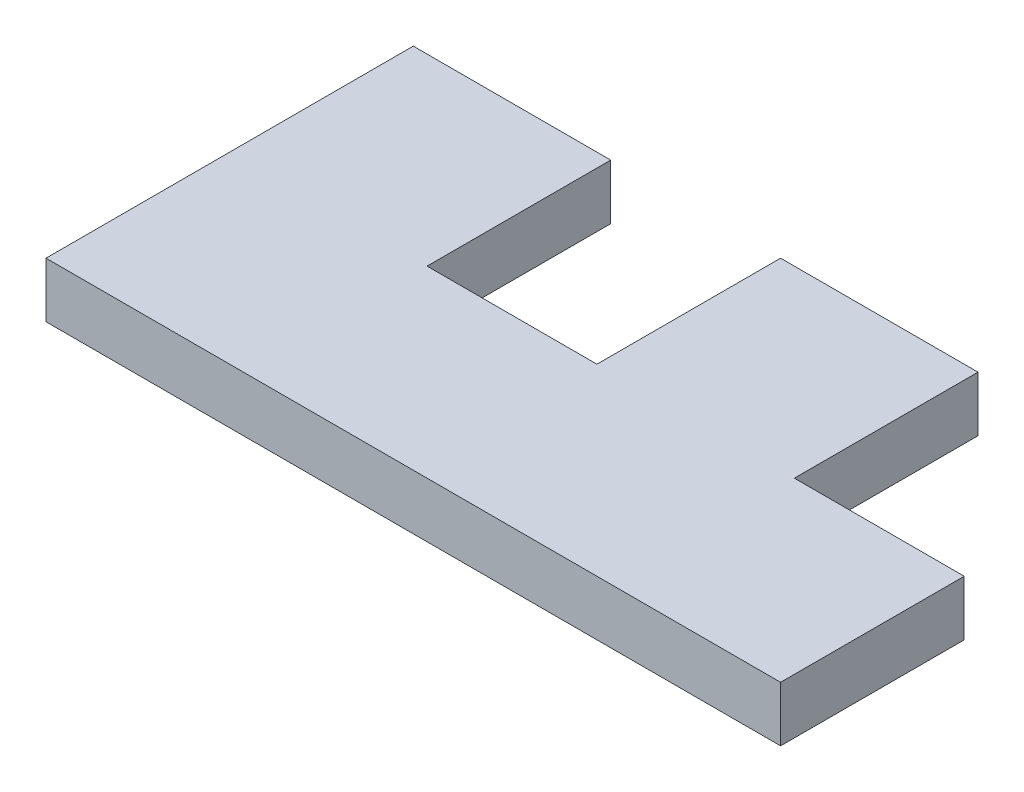
ISO-10303-21;
HEADER;
FILE_DESCRIPTION(('STEP AP214'),'2;1');
FILE_NAME('part.step','',(''),(''),'','','');
FILE_SCHEMA(('AUTOMOTIVE_DESIGN { 1 0 10303 214 1 1 1 1 }'));
ENDSEC;
DATA;
#1=APPLICATION_CONTEXT('core data for automotive mechanical design processes');
#2=APPLICATION_PROTOCOL_DEFINITION('international standard','automotive_design',2000,#1);
#3=PRODUCT_CONTEXT('',#1,'mechanical');
#4=PRODUCT('Part','Part','',(#3));
#5=PRODUCT_RELATED_PRODUCT_CATEGORY('part','',(#4));
#6=PRODUCT_DEFINITION_FORMATION('','',#4);
#7=PRODUCT_DEFINITION_CONTEXT('part definition',#1,'design');
#8=PRODUCT_DEFINITION('design','',#6,#7);
#9=PRODUCT_DEFINITION_SHAPE('','',#8);
#10=(LENGTH_UNIT() NAMED_UNIT(*) SI_UNIT(.MILLI.,.METRE.));
#11=(NAMED_UNIT(*) PLANE_ANGLE_UNIT() SI_UNIT($,.RADIAN.));
#12=(NAMED_UNIT(*) SI_UNIT($,.STERADIAN.) SOLID_ANGLE_UNIT());
#13=UNCERTAINTY_MEASURE_WITH_UNIT(LENGTH_MEASURE(1.E-05),#10,'distance_accuracy_value','');
#14=(GEOMETRIC_REPRESENTATION_CONTEXT(3) GLOBAL_UNCERTAINTY_ASSIGNED_CONTEXT((#13)) GLOBAL_UNIT_ASSIGNED_CONTEXT((#10,
#11,#12)) REPRESENTATION_CONTEXT('',''));
#15=CARTESIAN_POINT('',(0.,0.,0.));
#16=DIRECTION('',(0.,0.,1.));
#17=DIRECTION('',(1.,0.,0.));
#18=AXIS2_PLACEMENT_3D('',#15,#16,#17);
#19=CARTESIAN_POINT('',(0.,3.,-20.));
#20=DIRECTION('',(0.,0.,1.));
#21=DIRECTION('',(1.,0.,0.));
#22=AXIS2_PLACEMENT_3D('',#19,#20,#21);
#23=PLANE('',#22);
#24=DIRECTION('',(-1.,0.,0.));
#25=VECTOR('',#24,1.);
#26=CARTESIAN_POINT('',(0.,0.,-20.));
#27=LINE('',#26,#25);
#28=CARTESIAN_POINT('',(30.75,0.,-20.));
#29=VERTEX_POINT('',#28);
#30=CARTESIAN_POINT('',(20.,0.,-20.));
#31=VERTEX_POINT('',#30);
#32=EDGE_CURVE('E134',#29,#31,#27,.T.);
#33=ORIENTED_EDGE('',*,*,#32,.T.);
#34=DIRECTION('',(0.,1.,0.));
#35=VECTOR('',#34,1.);
#36=CARTESIAN_POINT('',(20.,0.,-20.));
#37=LINE('',#36,#35);
#38=CARTESIAN_POINT('',(20.,3.,-20.));
#39=VERTEX_POINT('',#38);
#40=EDGE_CURVE('E180',#31,#39,#37,.T.);
#41=ORIENTED_EDGE('',*,*,#40,.T.);
#42=DIRECTION('',(-1.,0.,0.));
#43=VECTOR('',#42,1.);
#44=CARTESIAN_POINT('',(0.,3.,-20.));
#45=LINE('',#44,#43);
#46=CARTESIAN_POINT('',(30.75,3.,-20.));
#47=VERTEX_POINT('',#46);
#48=EDGE_CURVE('E145',#47,#39,#45,.T.);
#49=ORIENTED_EDGE('',*,*,#48,.F.);
#50=DIRECTION('',(0.,1.,0.));
#51=VECTOR('',#50,1.);
#52=CARTESIAN_POINT('',(30.75,0.,-20.));
#53=LINE('',#52,#51);
#54=EDGE_CURVE('E159',#29,#47,#53,.T.);
#55=ORIENTED_EDGE('',*,*,#54,.F.);
#56=EDGE_LOOP('',(#33,#41,#49,#55));
#57=FACE_BOUND('',#56,.T.);
#58=ADVANCED_FACE('F33',(#57),#23,.F.);
#59=CARTESIAN_POINT('',(0.,3.,0.));
#60=DIRECTION('',(1.,0.,0.));
#61=DIRECTION('',(0.,0.,-1.));
#62=AXIS2_PLACEMENT_3D('',#59,#60,#61);
#63=PLANE('',#62);
#64=DIRECTION('',(0.,0.,1.));
#65=VECTOR('',#64,1.);
#66=CARTESIAN_POINT('',(0.,0.,0.));
#67=LINE('',#66,#65);
#68=CARTESIAN_POINT('',(0.,0.,-20.));
#69=VERTEX_POINT('',#68);
#70=CARTESIAN_POINT('',(0.,0.,0.));
#71=VERTEX_POINT('',#70);
#72=EDGE_CURVE('E133',#69,#71,#67,.T.);
#73=ORIENTED_EDGE('',*,*,#72,.T.);
#74=DIRECTION('',(0.,-1.,0.));
#75=VECTOR('',#74,1.);
#76=CARTESIAN_POINT('',(0.,3.,0.));
#77=LINE('',#76,#75);
#78=CARTESIAN_POINT('',(0.,3.,0.));
#79=VERTEX_POINT('',#78);
#80=EDGE_CURVE('E11',#79,#71,#77,.T.);
#81=ORIENTED_EDGE('',*,*,#80,.F.);
#82=DIRECTION('',(0.,0.,1.));
#83=VECTOR('',#82,1.);
#84=CARTESIAN_POINT('',(0.,3.,0.));
#85=LINE('',#84,#83);
#86=CARTESIAN_POINT('',(0.,3.,-20.));
#87=VERTEX_POINT('',#86);
#88=EDGE_CURVE('E138',#87,#79,#85,.T.);
#89=ORIENTED_EDGE('',*,*,#88,.F.);
#90=DIRECTION('',(0.,-1.,0.));
#91=VECTOR('',#90,1.);
#92=CARTESIAN_POINT('',(0.,3.,-20.));
#93=LINE('',#92,#91);
#94=EDGE_CURVE('E144',#87,#69,#93,.T.);
#95=ORIENTED_EDGE('',*,*,#94,.T.);
#96=EDGE_LOOP('',(#73,#81,#89,#95));
#97=FACE_BOUND('',#96,.T.);
#98=ADVANCED_FACE('F35',(#97),#63,.F.);
#99=CARTESIAN_POINT('',(0.,3.,0.));
#100=DIRECTION('',(0.,0.,-1.));
#101=DIRECTION('',(-1.,0.,0.));
#102=AXIS2_PLACEMENT_3D('',#99,#100,#101);
#103=PLANE('',#102);
#104=DIRECTION('',(1.,0.,0.));
#105=VECTOR('',#104,1.);
#106=CARTESIAN_POINT('',(0.,0.,0.));
#107=LINE('',#106,#105);
#108=CARTESIAN_POINT('',(40.,0.,0.));
#109=VERTEX_POINT('',#108);
#110=EDGE_CURVE('E140',#71,#109,#107,.T.);
#111=ORIENTED_EDGE('',*,*,#110,.T.);
#112=DIRECTION('',(0.,-1.,0.));
#113=VECTOR('',#112,1.);
#114=CARTESIAN_POINT('',(40.,3.,0.));
#115=LINE('',#114,#113);
#116=CARTESIAN_POINT('',(40.,3.,0.));
#117=VERTEX_POINT('',#116);
#118=EDGE_CURVE('E41',#117,#109,#115,.T.);
#119=ORIENTED_EDGE('',*,*,#118,.F.);
#120=DIRECTION('',(1.,0.,0.));
#121=VECTOR('',#120,1.);
#122=CARTESIAN_POINT('',(0.,3.,0.));
#123=LINE('',#122,#121);
#124=EDGE_CURVE('E176',#79,#117,#123,.T.);
#125=ORIENTED_EDGE('',*,*,#124,.F.);
#126=ORIENTED_EDGE('',*,*,#80,.T.);
#127=EDGE_LOOP('',(#111,#119,#125,#126));
#128=FACE_BOUND('',#127,.T.);
#129=ADVANCED_FACE('F181',(#128),#103,.F.);
#130=CARTESIAN_POINT('',(40.,3.,0.));
#131=DIRECTION('',(-1.,0.,0.));
#132=DIRECTION('',(0.,0.,1.));
#133=AXIS2_PLACEMENT_3D('',#130,#131,#132);
#134=PLANE('',#133);
#135=DIRECTION('',(0.,0.,-1.));
#136=VECTOR('',#135,1.);
#137=CARTESIAN_POINT('',(40.,0.,0.));
#138=LINE('',#137,#136);
#139=CARTESIAN_POINT('',(40.,0.,-10.));
#140=VERTEX_POINT('',#139);
#141=EDGE_CURVE('E135',#109,#140,#138,.T.);
#142=ORIENTED_EDGE('',*,*,#141,.T.);
#143=DIRECTION('',(0.,1.,0.));
#144=VECTOR('',#143,1.);
#145=CARTESIAN_POINT('',(40.,0.,-10.));
#146=LINE('',#145,#144);
#147=CARTESIAN_POINT('',(40.,3.,-10.));
#148=VERTEX_POINT('',#147);
#149=EDGE_CURVE('E170',#140,#148,#146,.T.);
#150=ORIENTED_EDGE('',*,*,#149,.T.);
#151=DIRECTION('',(0.,0.,-1.));
#152=VECTOR('',#151,1.);
#153=CARTESIAN_POINT('',(40.,3.,0.));
#154=LINE('',#153,#152);
#155=EDGE_CURVE('E154',#117,#148,#154,.T.);
#156=ORIENTED_EDGE('',*,*,#155,.F.);
#157=ORIENTED_EDGE('',*,*,#118,.T.);
#158=EDGE_LOOP('',(#142,#150,#156,#157));
#159=FACE_BOUND('',#158,.T.);
#160=ADVANCED_FACE('F151',(#159),#134,.F.);
#161=CARTESIAN_POINT('',(10.75,3.,-20.));
#162=VERTEX_POINT('',#161);
#163=EDGE_CURVE('E126',#162,#87,#45,.T.);
#164=ORIENTED_EDGE('',*,*,#163,.F.);
#165=DIRECTION('',(0.,1.,0.));
#166=VECTOR('',#165,1.);
#167=CARTESIAN_POINT('',(10.75,0.,-20.));
#168=LINE('',#167,#166);
#169=CARTESIAN_POINT('',(10.75,0.,-20.));
#170=VERTEX_POINT('',#169);
#171=EDGE_CURVE('E113',#170,#162,#168,.T.);
#172=ORIENTED_EDGE('',*,*,#171,.F.);
#173=EDGE_CURVE('E124',#170,#69,#27,.T.);
#174=ORIENTED_EDGE('',*,*,#173,.T.);
#175=ORIENTED_EDGE('',*,*,#94,.F.);
#176=EDGE_LOOP('',(#164,#172,#174,#175));
#177=FACE_BOUND('',#176,.T.);
#178=ADVANCED_FACE('F122',(#177),#23,.F.);
#179=CARTESIAN_POINT('',(0.,3.,0.));
#180=DIRECTION('',(0.,-1.,0.));
#181=DIRECTION('',(0.,0.,-1.));
#182=AXIS2_PLACEMENT_3D('',#179,#180,#181);
#183=PLANE('',#182);
#184=ORIENTED_EDGE('',*,*,#48,.T.);
#185=DIRECTION('',(0.,0.,-1.));
#186=VECTOR('',#185,1.);
#187=CARTESIAN_POINT('',(20.,3.,-10.));
#188=LINE('',#187,#186);
#189=CARTESIAN_POINT('',(20.,3.,-10.));
#190=VERTEX_POINT('',#189);
#191=EDGE_CURVE('E118',#190,#39,#188,.T.);
#192=ORIENTED_EDGE('',*,*,#191,.F.);
#193=DIRECTION('',(1.,0.,0.));
#194=VECTOR('',#193,1.);
#195=CARTESIAN_POINT('',(10.75,3.,-10.));
#196=LINE('',#195,#194);
#197=CARTESIAN_POINT('',(10.75,3.,-10.));
#198=VERTEX_POINT('',#197);
#199=EDGE_CURVE('E191',#198,#190,#196,.T.);
#200=ORIENTED_EDGE('',*,*,#199,.F.);
#201=DIRECTION('',(0.,0.,1.));
#202=VECTOR('',#201,1.);
#203=CARTESIAN_POINT('',(10.75,3.,-20.));
#204=LINE('',#203,#202);
#205=EDGE_CURVE('E172',#162,#198,#204,.T.);
#206=ORIENTED_EDGE('',*,*,#205,.F.);
#207=ORIENTED_EDGE('',*,*,#163,.T.);
#208=ORIENTED_EDGE('',*,*,#88,.T.);
#209=ORIENTED_EDGE('',*,*,#124,.T.);
#210=ORIENTED_EDGE('',*,*,#155,.T.);
#211=DIRECTION('',(1.,0.,0.));
#212=VECTOR('',#211,1.);
#213=CARTESIAN_POINT('',(30.75,3.,-10.));
#214=LINE('',#213,#212);
#215=CARTESIAN_POINT('',(30.75,3.,-10.));
#216=VERTEX_POINT('',#215);
#217=EDGE_CURVE('E163',#216,#148,#214,.T.);
#218=ORIENTED_EDGE('',*,*,#217,.F.);
#219=DIRECTION('',(0.,0.,1.));
#220=VECTOR('',#219,1.);
#221=CARTESIAN_POINT('',(30.75,3.,-20.));
#222=LINE('',#221,#220);
#223=EDGE_CURVE('E166',#47,#216,#222,.T.);
#224=ORIENTED_EDGE('',*,*,#223,.F.);
#225=EDGE_LOOP('',(#184,#192,#200,#206,#207,#208,#209,#210,#218,#224));
#226=FACE_BOUND('',#225,.T.);
#227=ADVANCED_FACE('F187',(#226),#183,.F.);
#228=CARTESIAN_POINT('',(0.,0.,0.));
#229=DIRECTION('',(0.,-1.,0.));
#230=DIRECTION('',(0.,0.,-1.));
#231=AXIS2_PLACEMENT_3D('',#228,#229,#230);
#232=PLANE('',#231);
#233=DIRECTION('',(0.,0.,-1.));
#234=VECTOR('',#233,1.);
#235=CARTESIAN_POINT('',(20.,0.,-10.));
#236=LINE('',#235,#234);
#237=CARTESIAN_POINT('',(20.,0.,-10.));
#238=VERTEX_POINT('',#237);
#239=EDGE_CURVE('E127',#238,#31,#236,.T.);
#240=ORIENTED_EDGE('',*,*,#239,.T.);
#241=ORIENTED_EDGE('',*,*,#32,.F.);
#242=DIRECTION('',(0.,0.,1.));
#243=VECTOR('',#242,1.);
#244=CARTESIAN_POINT('',(30.75,0.,-20.));
#245=LINE('',#244,#243);
#246=CARTESIAN_POINT('',(30.75,0.,-10.));
#247=VERTEX_POINT('',#246);
#248=EDGE_CURVE('E158',#29,#247,#245,.T.);
#249=ORIENTED_EDGE('',*,*,#248,.T.);
#250=DIRECTION('',(1.,0.,0.));
#251=VECTOR('',#250,1.);
#252=CARTESIAN_POINT('',(30.75,0.,-10.));
#253=LINE('',#252,#251);
#254=EDGE_CURVE('E56',#247,#140,#253,.T.);
#255=ORIENTED_EDGE('',*,*,#254,.T.);
#256=ORIENTED_EDGE('',*,*,#141,.F.);
#257=ORIENTED_EDGE('',*,*,#110,.F.);
#258=ORIENTED_EDGE('',*,*,#72,.F.);
#259=ORIENTED_EDGE('',*,*,#173,.F.);
#260=DIRECTION('',(0.,0.,1.));
#261=VECTOR('',#260,1.);
#262=CARTESIAN_POINT('',(10.75,0.,-20.));
#263=LINE('',#262,#261);
#264=CARTESIAN_POINT('',(10.75,0.,-10.));
#265=VERTEX_POINT('',#264);
#266=EDGE_CURVE('E109',#170,#265,#263,.T.);
#267=ORIENTED_EDGE('',*,*,#266,.T.);
#268=DIRECTION('',(1.,0.,0.));
#269=VECTOR('',#268,1.);
#270=CARTESIAN_POINT('',(10.75,0.,-10.));
#271=LINE('',#270,#269);
#272=EDGE_CURVE('E48',#265,#238,#271,.T.);
#273=ORIENTED_EDGE('',*,*,#272,.T.);
#274=EDGE_LOOP('',(#240,#241,#249,#255,#256,#257,#258,#259,#267,#273));
#275=FACE_BOUND('',#274,.T.);
#276=ADVANCED_FACE('F131',(#275),#232,.T.);
#277=CARTESIAN_POINT('',(30.75,0.,-10.));
#278=DIRECTION('',(0.,0.,1.));
#279=DIRECTION('',(1.,0.,0.));
#280=AXIS2_PLACEMENT_3D('',#277,#278,#279);
#281=PLANE('',#280);
#282=ORIENTED_EDGE('',*,*,#217,.T.);
#283=ORIENTED_EDGE('',*,*,#149,.F.);
#284=ORIENTED_EDGE('',*,*,#254,.F.);
#285=DIRECTION('',(0.,1.,0.));
#286=VECTOR('',#285,1.);
#287=CARTESIAN_POINT('',(30.75,0.,-10.));
#288=LINE('',#287,#286);
#289=EDGE_CURVE('E161',#247,#216,#288,.T.);
#290=ORIENTED_EDGE('',*,*,#289,.T.);
#291=EDGE_LOOP('',(#282,#283,#284,#290));
#292=FACE_BOUND('',#291,.T.);
#293=ADVANCED_FACE('F213',(#292),#281,.F.);
#294=CARTESIAN_POINT('',(30.75,0.,-20.));
#295=DIRECTION('',(-1.,0.,0.));
#296=DIRECTION('',(0.,0.,1.));
#297=AXIS2_PLACEMENT_3D('',#294,#295,#296);
#298=PLANE('',#297);
#299=ORIENTED_EDGE('',*,*,#223,.T.);
#300=ORIENTED_EDGE('',*,*,#289,.F.);
#301=ORIENTED_EDGE('',*,*,#248,.F.);
#302=ORIENTED_EDGE('',*,*,#54,.T.);
#303=EDGE_LOOP('',(#299,#300,#301,#302));
#304=FACE_BOUND('',#303,.T.);
#305=ADVANCED_FACE('F211',(#304),#298,.F.);
#306=CARTESIAN_POINT('',(20.,0.,-10.));
#307=DIRECTION('',(1.,0.,0.));
#308=DIRECTION('',(0.,0.,-1.));
#309=AXIS2_PLACEMENT_3D('',#306,#307,#308);
#310=PLANE('',#309);
#311=ORIENTED_EDGE('',*,*,#191,.T.);
#312=ORIENTED_EDGE('',*,*,#40,.F.);
#313=ORIENTED_EDGE('',*,*,#239,.F.);
#314=DIRECTION('',(0.,1.,0.));
#315=VECTOR('',#314,1.);
#316=CARTESIAN_POINT('',(20.,0.,-10.));
#317=LINE('',#316,#315);
#318=EDGE_CURVE('E200',#238,#190,#317,.T.);
#319=ORIENTED_EDGE('',*,*,#318,.T.);
#320=EDGE_LOOP('',(#311,#312,#313,#319));
#321=FACE_BOUND('',#320,.T.);
#322=ADVANCED_FACE('F207',(#321),#310,.F.);
#323=CARTESIAN_POINT('',(10.75,0.,-10.));
#324=DIRECTION('',(0.,0.,1.));
#325=DIRECTION('',(1.,0.,0.));
#326=AXIS2_PLACEMENT_3D('',#323,#324,#325);
#327=PLANE('',#326);
#328=ORIENTED_EDGE('',*,*,#199,.T.);
#329=ORIENTED_EDGE('',*,*,#318,.F.);
#330=ORIENTED_EDGE('',*,*,#272,.F.);
#331=DIRECTION('',(0.,1.,0.));
#332=VECTOR('',#331,1.);
#333=CARTESIAN_POINT('',(10.75,0.,-10.));
#334=LINE('',#333,#332);
#335=EDGE_CURVE('E115',#265,#198,#334,.T.);
#336=ORIENTED_EDGE('',*,*,#335,.T.);
#337=EDGE_LOOP('',(#328,#329,#330,#336));
#338=FACE_BOUND('',#337,.T.);
#339=ADVANCED_FACE('F202',(#338),#327,.F.);
#340=CARTESIAN_POINT('',(10.75,0.,-20.));
#341=DIRECTION('',(-1.,0.,0.));
#342=DIRECTION('',(0.,0.,1.));
#343=AXIS2_PLACEMENT_3D('',#340,#341,#342);
#344=PLANE('',#343);
#345=ORIENTED_EDGE('',*,*,#205,.T.);
#346=ORIENTED_EDGE('',*,*,#335,.F.);
#347=ORIENTED_EDGE('',*,*,#266,.F.);
#348=ORIENTED_EDGE('',*,*,#171,.T.);
#349=EDGE_LOOP('',(#345,#346,#347,#348));
#350=FACE_BOUND('',#349,.T.);
#351=ADVANCED_FACE('F112',(#350),#344,.F.);
#352=CLOSED_SHELL('',(#58,#98,#129,#160,#178,#227,#276,#293,#305,#322,#339,#351));
#353=MANIFOLD_SOLID_BREP('B2',#352);
#354=ADVANCED_BREP_SHAPE_REPRESENTATION('',(#18,#353),#14);
#355=SHAPE_DEFINITION_REPRESENTATION(#9,#354);
ENDSEC;
END-ISO-10303-21;
